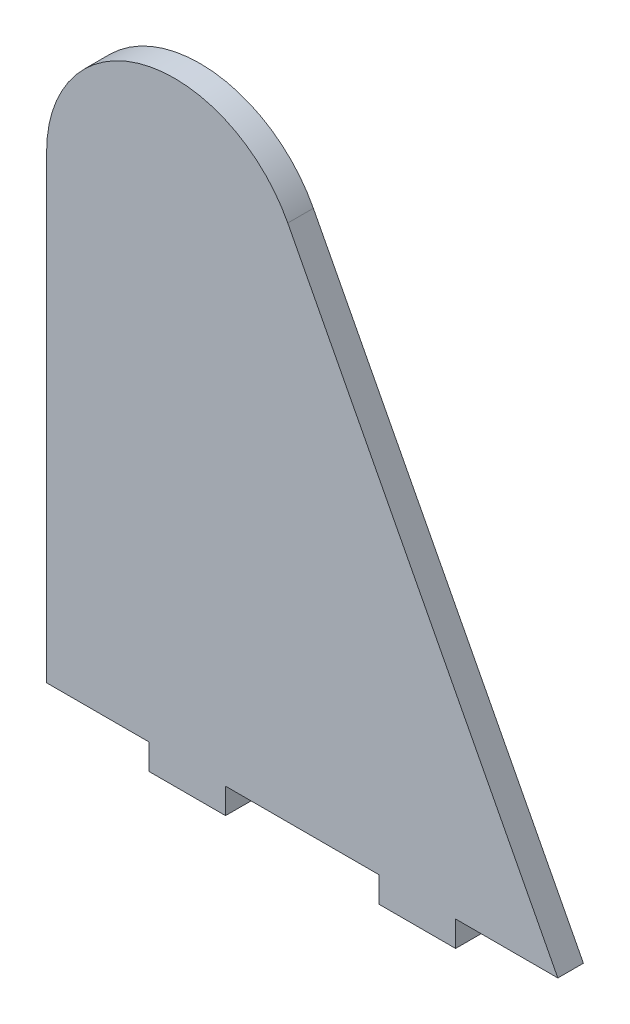
ISO-10303-21;
HEADER;
FILE_DESCRIPTION(('STEP AP214'),'2;1');
FILE_NAME('part.step','',(''),(''),'','','');
FILE_SCHEMA(('AUTOMOTIVE_DESIGN { 1 0 10303 214 1 1 1 1 }'));
ENDSEC;
DATA;
#1=APPLICATION_CONTEXT('core data for automotive mechanical design processes');
#2=APPLICATION_PROTOCOL_DEFINITION('international standard','automotive_design',2000,#1);
#3=PRODUCT_CONTEXT('',#1,'mechanical');
#4=PRODUCT('Part','Part','',(#3));
#5=PRODUCT_RELATED_PRODUCT_CATEGORY('part','',(#4));
#6=PRODUCT_DEFINITION_FORMATION('','',#4);
#7=PRODUCT_DEFINITION_CONTEXT('part definition',#1,'design');
#8=PRODUCT_DEFINITION('design','',#6,#7);
#9=PRODUCT_DEFINITION_SHAPE('','',#8);
#10=(LENGTH_UNIT() NAMED_UNIT(*) SI_UNIT(.MILLI.,.METRE.));
#11=(NAMED_UNIT(*) PLANE_ANGLE_UNIT() SI_UNIT($,.RADIAN.));
#12=(NAMED_UNIT(*) SI_UNIT($,.STERADIAN.) SOLID_ANGLE_UNIT());
#13=UNCERTAINTY_MEASURE_WITH_UNIT(LENGTH_MEASURE(1.E-05),#10,'distance_accuracy_value','');
#14=(GEOMETRIC_REPRESENTATION_CONTEXT(3) GLOBAL_UNCERTAINTY_ASSIGNED_CONTEXT((#13)) GLOBAL_UNIT_ASSIGNED_CONTEXT((#10,
#11,#12)) REPRESENTATION_CONTEXT('',''));
#15=CARTESIAN_POINT('',(0.,0.,0.));
#16=DIRECTION('',(0.,0.,1.));
#17=DIRECTION('',(1.,0.,0.));
#18=AXIS2_PLACEMENT_3D('',#15,#16,#17);
#19=CARTESIAN_POINT('',(0.,0.,5.));
#20=DIRECTION('',(0.,1.,0.));
#21=DIRECTION('',(0.,0.,1.));
#22=AXIS2_PLACEMENT_3D('',#19,#20,#21);
#23=PLANE('',#22);
#24=DIRECTION('',(1.,0.,0.));
#25=VECTOR('',#24,1.);
#26=CARTESIAN_POINT('',(0.,0.,0.));
#27=LINE('',#26,#25);
#28=CARTESIAN_POINT('',(0.,0.,0.));
#29=VERTEX_POINT('',#28);
#30=CARTESIAN_POINT('',(20.,0.,0.));
#31=VERTEX_POINT('',#30);
#32=EDGE_CURVE('E153',#29,#31,#27,.T.);
#33=ORIENTED_EDGE('',*,*,#32,.T.);
#34=DIRECTION('',(0.,0.,-1.));
#35=VECTOR('',#34,1.);
#36=CARTESIAN_POINT('',(20.,0.,5.));
#37=LINE('',#36,#35);
#38=CARTESIAN_POINT('',(20.,0.,5.));
#39=VERTEX_POINT('',#38);
#40=EDGE_CURVE('E11',#39,#31,#37,.T.);
#41=ORIENTED_EDGE('',*,*,#40,.F.);
#42=DIRECTION('',(1.,0.,0.));
#43=VECTOR('',#42,1.);
#44=CARTESIAN_POINT('',(0.,0.,5.));
#45=LINE('',#44,#43);
#46=CARTESIAN_POINT('',(0.,0.,5.));
#47=VERTEX_POINT('',#46);
#48=EDGE_CURVE('E175',#47,#39,#45,.T.);
#49=ORIENTED_EDGE('',*,*,#48,.F.);
#50=DIRECTION('',(0.,0.,-1.));
#51=VECTOR('',#50,1.);
#52=CARTESIAN_POINT('',(0.,0.,5.));
#53=LINE('',#52,#51);
#54=EDGE_CURVE('E149',#47,#29,#53,.T.);
#55=ORIENTED_EDGE('',*,*,#54,.T.);
#56=EDGE_LOOP('',(#33,#41,#49,#55));
#57=FACE_BOUND('',#56,.T.);
#58=ADVANCED_FACE('F33',(#57),#23,.F.);
#59=CARTESIAN_POINT('',(20.,0.,5.));
#60=DIRECTION('',(1.,0.,0.));
#61=DIRECTION('',(0.,0.,-1.));
#62=AXIS2_PLACEMENT_3D('',#59,#60,#61);
#63=PLANE('',#62);
#64=DIRECTION('',(0.,-1.,0.));
#65=VECTOR('',#64,1.);
#66=CARTESIAN_POINT('',(20.,0.,0.));
#67=LINE('',#66,#65);
#68=CARTESIAN_POINT('',(20.,-5.,0.));
#69=VERTEX_POINT('',#68);
#70=EDGE_CURVE('E156',#31,#69,#67,.T.);
#71=ORIENTED_EDGE('',*,*,#70,.T.);
#72=DIRECTION('',(0.,0.,-1.));
#73=VECTOR('',#72,1.);
#74=CARTESIAN_POINT('',(20.,-5.,5.));
#75=LINE('',#74,#73);
#76=CARTESIAN_POINT('',(20.,-5.,5.));
#77=VERTEX_POINT('',#76);
#78=EDGE_CURVE('E41',#77,#69,#75,.T.);
#79=ORIENTED_EDGE('',*,*,#78,.F.);
#80=DIRECTION('',(0.,-1.,0.));
#81=VECTOR('',#80,1.);
#82=CARTESIAN_POINT('',(20.,0.,5.));
#83=LINE('',#82,#81);
#84=EDGE_CURVE('E104',#39,#77,#83,.T.);
#85=ORIENTED_EDGE('',*,*,#84,.F.);
#86=ORIENTED_EDGE('',*,*,#40,.T.);
#87=EDGE_LOOP('',(#71,#79,#85,#86));
#88=FACE_BOUND('',#87,.T.);
#89=ADVANCED_FACE('F253',(#88),#63,.F.);
#90=CARTESIAN_POINT('',(20.,-5.,5.));
#91=DIRECTION('',(0.,1.,0.));
#92=DIRECTION('',(0.,0.,1.));
#93=AXIS2_PLACEMENT_3D('',#90,#91,#92);
#94=PLANE('',#93);
#95=DIRECTION('',(1.,0.,0.));
#96=VECTOR('',#95,1.);
#97=CARTESIAN_POINT('',(20.,-5.,0.));
#98=LINE('',#97,#96);
#99=CARTESIAN_POINT('',(35.,-5.,0.));
#100=VERTEX_POINT('',#99);
#101=EDGE_CURVE('E158',#69,#100,#98,.T.);
#102=ORIENTED_EDGE('',*,*,#101,.T.);
#103=DIRECTION('',(0.,0.,-1.));
#104=VECTOR('',#103,1.);
#105=CARTESIAN_POINT('',(35.,-5.,5.));
#106=LINE('',#105,#104);
#107=CARTESIAN_POINT('',(35.,-5.,5.));
#108=VERTEX_POINT('',#107);
#109=EDGE_CURVE('E194',#108,#100,#106,.T.);
#110=ORIENTED_EDGE('',*,*,#109,.F.);
#111=DIRECTION('',(1.,0.,0.));
#112=VECTOR('',#111,1.);
#113=CARTESIAN_POINT('',(20.,-5.,5.));
#114=LINE('',#113,#112);
#115=EDGE_CURVE('E202',#77,#108,#114,.T.);
#116=ORIENTED_EDGE('',*,*,#115,.F.);
#117=ORIENTED_EDGE('',*,*,#78,.T.);
#118=EDGE_LOOP('',(#102,#110,#116,#117));
#119=FACE_BOUND('',#118,.T.);
#120=ADVANCED_FACE('F200',(#119),#94,.F.);
#121=CARTESIAN_POINT('',(35.,0.,5.));
#122=DIRECTION('',(-1.,0.,0.));
#123=DIRECTION('',(0.,0.,1.));
#124=AXIS2_PLACEMENT_3D('',#121,#122,#123);
#125=PLANE('',#124);
#126=DIRECTION('',(0.,1.,0.));
#127=VECTOR('',#126,1.);
#128=CARTESIAN_POINT('',(35.,0.,0.));
#129=LINE('',#128,#127);
#130=CARTESIAN_POINT('',(35.,0.,0.));
#131=VERTEX_POINT('',#130);
#132=EDGE_CURVE('E160',#100,#131,#129,.T.);
#133=ORIENTED_EDGE('',*,*,#132,.T.);
#134=DIRECTION('',(0.,0.,-1.));
#135=VECTOR('',#134,1.);
#136=CARTESIAN_POINT('',(35.,0.,5.));
#137=LINE('',#136,#135);
#138=CARTESIAN_POINT('',(35.,0.,5.));
#139=VERTEX_POINT('',#138);
#140=EDGE_CURVE('E191',#139,#131,#137,.T.);
#141=ORIENTED_EDGE('',*,*,#140,.F.);
#142=DIRECTION('',(0.,1.,0.));
#143=VECTOR('',#142,1.);
#144=CARTESIAN_POINT('',(35.,0.,5.));
#145=LINE('',#144,#143);
#146=EDGE_CURVE('E220',#108,#139,#145,.T.);
#147=ORIENTED_EDGE('',*,*,#146,.F.);
#148=ORIENTED_EDGE('',*,*,#109,.T.);
#149=EDGE_LOOP('',(#133,#141,#147,#148));
#150=FACE_BOUND('',#149,.T.);
#151=ADVANCED_FACE('F211',(#150),#125,.F.);
#152=CARTESIAN_POINT('',(35.,0.,5.));
#153=DIRECTION('',(0.,1.,0.));
#154=DIRECTION('',(0.,0.,1.));
#155=AXIS2_PLACEMENT_3D('',#152,#153,#154);
#156=PLANE('',#155);
#157=DIRECTION('',(1.,0.,0.));
#158=VECTOR('',#157,1.);
#159=CARTESIAN_POINT('',(35.,0.,0.));
#160=LINE('',#159,#158);
#161=CARTESIAN_POINT('',(65.,0.,0.));
#162=VERTEX_POINT('',#161);
#163=EDGE_CURVE('E162',#131,#162,#160,.T.);
#164=ORIENTED_EDGE('',*,*,#163,.T.);
#165=DIRECTION('',(0.,0.,-1.));
#166=VECTOR('',#165,1.);
#167=CARTESIAN_POINT('',(65.,0.,5.));
#168=LINE('',#167,#166);
#169=CARTESIAN_POINT('',(65.,0.,5.));
#170=VERTEX_POINT('',#169);
#171=EDGE_CURVE('E188',#170,#162,#168,.T.);
#172=ORIENTED_EDGE('',*,*,#171,.F.);
#173=DIRECTION('',(1.,0.,0.));
#174=VECTOR('',#173,1.);
#175=CARTESIAN_POINT('',(35.,0.,5.));
#176=LINE('',#175,#174);
#177=EDGE_CURVE('E217',#139,#170,#176,.T.);
#178=ORIENTED_EDGE('',*,*,#177,.F.);
#179=ORIENTED_EDGE('',*,*,#140,.T.);
#180=EDGE_LOOP('',(#164,#172,#178,#179));
#181=FACE_BOUND('',#180,.T.);
#182=ADVANCED_FACE('F215',(#181),#156,.F.);
#183=CARTESIAN_POINT('',(65.,0.,5.));
#184=DIRECTION('',(1.,0.,0.));
#185=DIRECTION('',(0.,0.,-1.));
#186=AXIS2_PLACEMENT_3D('',#183,#184,#185);
#187=PLANE('',#186);
#188=DIRECTION('',(0.,-1.,0.));
#189=VECTOR('',#188,1.);
#190=CARTESIAN_POINT('',(65.,0.,0.));
#191=LINE('',#190,#189);
#192=CARTESIAN_POINT('',(65.,-5.,0.));
#193=VERTEX_POINT('',#192);
#194=EDGE_CURVE('E164',#162,#193,#191,.T.);
#195=ORIENTED_EDGE('',*,*,#194,.T.);
#196=DIRECTION('',(0.,0.,-1.));
#197=VECTOR('',#196,1.);
#198=CARTESIAN_POINT('',(65.,-5.,5.));
#199=LINE('',#198,#197);
#200=CARTESIAN_POINT('',(65.,-5.,5.));
#201=VERTEX_POINT('',#200);
#202=EDGE_CURVE('E185',#201,#193,#199,.T.);
#203=ORIENTED_EDGE('',*,*,#202,.F.);
#204=DIRECTION('',(0.,-1.,0.));
#205=VECTOR('',#204,1.);
#206=CARTESIAN_POINT('',(65.,0.,5.));
#207=LINE('',#206,#205);
#208=EDGE_CURVE('E219',#170,#201,#207,.T.);
#209=ORIENTED_EDGE('',*,*,#208,.F.);
#210=ORIENTED_EDGE('',*,*,#171,.T.);
#211=EDGE_LOOP('',(#195,#203,#209,#210));
#212=FACE_BOUND('',#211,.T.);
#213=ADVANCED_FACE('F266',(#212),#187,.F.);
#214=CARTESIAN_POINT('',(65.,-5.,5.));
#215=DIRECTION('',(0.,1.,0.));
#216=DIRECTION('',(0.,0.,1.));
#217=AXIS2_PLACEMENT_3D('',#214,#215,#216);
#218=PLANE('',#217);
#219=DIRECTION('',(1.,0.,0.));
#220=VECTOR('',#219,1.);
#221=CARTESIAN_POINT('',(65.,-5.,0.));
#222=LINE('',#221,#220);
#223=CARTESIAN_POINT('',(80.,-5.,0.));
#224=VERTEX_POINT('',#223);
#225=EDGE_CURVE('E166',#193,#224,#222,.T.);
#226=ORIENTED_EDGE('',*,*,#225,.T.);
#227=DIRECTION('',(0.,0.,-1.));
#228=VECTOR('',#227,1.);
#229=CARTESIAN_POINT('',(80.,-5.,5.));
#230=LINE('',#229,#228);
#231=CARTESIAN_POINT('',(80.,-5.,5.));
#232=VERTEX_POINT('',#231);
#233=EDGE_CURVE('E182',#232,#224,#230,.T.);
#234=ORIENTED_EDGE('',*,*,#233,.F.);
#235=DIRECTION('',(1.,0.,0.));
#236=VECTOR('',#235,1.);
#237=CARTESIAN_POINT('',(65.,-5.,5.));
#238=LINE('',#237,#236);
#239=EDGE_CURVE('E222',#201,#232,#238,.T.);
#240=ORIENTED_EDGE('',*,*,#239,.F.);
#241=ORIENTED_EDGE('',*,*,#202,.T.);
#242=EDGE_LOOP('',(#226,#234,#240,#241));
#243=FACE_BOUND('',#242,.T.);
#244=ADVANCED_FACE('F269',(#243),#218,.F.);
#245=CARTESIAN_POINT('',(80.,0.,5.));
#246=DIRECTION('',(-1.,0.,0.));
#247=DIRECTION('',(0.,0.,1.));
#248=AXIS2_PLACEMENT_3D('',#245,#246,#247);
#249=PLANE('',#248);
#250=DIRECTION('',(0.,1.,0.));
#251=VECTOR('',#250,1.);
#252=CARTESIAN_POINT('',(80.,0.,0.));
#253=LINE('',#252,#251);
#254=CARTESIAN_POINT('',(80.,0.,0.));
#255=VERTEX_POINT('',#254);
#256=EDGE_CURVE('E168',#224,#255,#253,.T.);
#257=ORIENTED_EDGE('',*,*,#256,.T.);
#258=DIRECTION('',(0.,0.,-1.));
#259=VECTOR('',#258,1.);
#260=CARTESIAN_POINT('',(80.,0.,5.));
#261=LINE('',#260,#259);
#262=CARTESIAN_POINT('',(80.,0.,5.));
#263=VERTEX_POINT('',#262);
#264=EDGE_CURVE('E179',#263,#255,#261,.T.);
#265=ORIENTED_EDGE('',*,*,#264,.F.);
#266=DIRECTION('',(0.,1.,0.));
#267=VECTOR('',#266,1.);
#268=CARTESIAN_POINT('',(80.,0.,5.));
#269=LINE('',#268,#267);
#270=EDGE_CURVE('E228',#232,#263,#269,.T.);
#271=ORIENTED_EDGE('',*,*,#270,.F.);
#272=ORIENTED_EDGE('',*,*,#233,.T.);
#273=EDGE_LOOP('',(#257,#265,#271,#272));
#274=FACE_BOUND('',#273,.T.);
#275=ADVANCED_FACE('F234',(#274),#249,.F.);
#276=CARTESIAN_POINT('',(80.,0.,5.));
#277=DIRECTION('',(0.,1.,0.));
#278=DIRECTION('',(0.,0.,1.));
#279=AXIS2_PLACEMENT_3D('',#276,#277,#278);
#280=PLANE('',#279);
#281=DIRECTION('',(1.,0.,0.));
#282=VECTOR('',#281,1.);
#283=CARTESIAN_POINT('',(80.,0.,0.));
#284=LINE('',#283,#282);
#285=CARTESIAN_POINT('',(100.,0.,0.));
#286=VERTEX_POINT('',#285);
#287=EDGE_CURVE('E170',#255,#286,#284,.T.);
#288=ORIENTED_EDGE('',*,*,#287,.T.);
#289=DIRECTION('',(0.,0.,-1.));
#290=VECTOR('',#289,1.);
#291=CARTESIAN_POINT('',(100.,0.,5.));
#292=LINE('',#291,#290);
#293=CARTESIAN_POINT('',(100.,0.,5.));
#294=VERTEX_POINT('',#293);
#295=EDGE_CURVE('E144',#294,#286,#292,.T.);
#296=ORIENTED_EDGE('',*,*,#295,.F.);
#297=DIRECTION('',(1.,0.,0.));
#298=VECTOR('',#297,1.);
#299=CARTESIAN_POINT('',(80.,0.,5.));
#300=LINE('',#299,#298);
#301=EDGE_CURVE('E135',#263,#294,#300,.T.);
#302=ORIENTED_EDGE('',*,*,#301,.F.);
#303=ORIENTED_EDGE('',*,*,#264,.T.);
#304=EDGE_LOOP('',(#288,#296,#302,#303));
#305=FACE_BOUND('',#304,.T.);
#306=ADVANCED_FACE('F238',(#305),#280,.F.);
#307=CARTESIAN_POINT('',(100.,0.,5.));
#308=DIRECTION('',(-0.887010833178219,-0.461748613235038,0.));
#309=DIRECTION('',(0.461748613235038,-0.887010833178219,0.));
#310=AXIS2_PLACEMENT_3D('',#307,#308,#309);
#311=PLANE('',#310);
#312=DIRECTION('',(-0.461748613235038,0.887010833178219,0.));
#313=VECTOR('',#312,1.);
#314=CARTESIAN_POINT('',(100.,0.,0.));
#315=LINE('',#314,#313);
#316=CARTESIAN_POINT('',(47.1752708294555,101.475360598707,0.));
#317=VERTEX_POINT('',#316);
#318=EDGE_CURVE('E143',#286,#317,#315,.T.);
#319=ORIENTED_EDGE('',*,*,#318,.T.);
#320=DIRECTION('',(0.,0.,-1.));
#321=VECTOR('',#320,1.);
#322=CARTESIAN_POINT('',(47.1752708294555,101.475360598707,5.));
#323=LINE('',#322,#321);
#324=CARTESIAN_POINT('',(47.1752708294555,101.475360598707,5.));
#325=VERTEX_POINT('',#324);
#326=EDGE_CURVE('E140',#325,#317,#323,.T.);
#327=ORIENTED_EDGE('',*,*,#326,.F.);
#328=DIRECTION('',(-0.461748613235038,0.887010833178219,0.));
#329=VECTOR('',#328,1.);
#330=CARTESIAN_POINT('',(100.,0.,5.));
#331=LINE('',#330,#329);
#332=EDGE_CURVE('E129',#294,#325,#331,.T.);
#333=ORIENTED_EDGE('',*,*,#332,.F.);
#334=ORIENTED_EDGE('',*,*,#295,.T.);
#335=EDGE_LOOP('',(#319,#327,#333,#334));
#336=FACE_BOUND('',#335,.T.);
#337=ADVANCED_FACE('F141',(#336),#311,.F.);
#338=CARTESIAN_POINT('',(25.,89.9316452678312,5.));
#339=DIRECTION('',(0.,0.,-1.));
#340=DIRECTION('',(-1.,0.,0.));
#341=AXIS2_PLACEMENT_3D('',#338,#339,#340);
#342=CYLINDRICAL_SURFACE('',#341,25.);
#343=CARTESIAN_POINT('',(25.,89.9316452678312,0.));
#344=DIRECTION('',(0.,0.,1.));
#345=DIRECTION('',(-1.,0.,0.));
#346=AXIS2_PLACEMENT_3D('',#343,#344,#345);
#347=CIRCLE('',#346,25.);
#348=CARTESIAN_POINT('',(0.,89.9316452678312,0.));
#349=VERTEX_POINT('',#348);
#350=EDGE_CURVE('E90',#317,#349,#347,.T.);
#351=ORIENTED_EDGE('',*,*,#350,.T.);
#352=DIRECTION('',(0.,0.,-1.));
#353=VECTOR('',#352,1.);
#354=CARTESIAN_POINT('',(0.,89.9316452678312,5.));
#355=LINE('',#354,#353);
#356=CARTESIAN_POINT('',(0.,89.9316452678312,5.));
#357=VERTEX_POINT('',#356);
#358=EDGE_CURVE('E145',#357,#349,#355,.T.);
#359=ORIENTED_EDGE('',*,*,#358,.F.);
#360=CARTESIAN_POINT('',(25.,89.9316452678312,5.));
#361=DIRECTION('',(0.,0.,1.));
#362=DIRECTION('',(-1.,0.,0.));
#363=AXIS2_PLACEMENT_3D('',#360,#361,#362);
#364=CIRCLE('',#363,25.);
#365=EDGE_CURVE('E133',#325,#357,#364,.T.);
#366=ORIENTED_EDGE('',*,*,#365,.F.);
#367=ORIENTED_EDGE('',*,*,#326,.T.);
#368=EDGE_LOOP('',(#351,#359,#366,#367));
#369=FACE_BOUND('',#368,.T.);
#370=ADVANCED_FACE('F147',(#369),#342,.T.);
#371=CARTESIAN_POINT('',(0.,89.9316452678312,5.));
#372=DIRECTION('',(1.,0.,0.));
#373=DIRECTION('',(0.,1.,0.));
#374=AXIS2_PLACEMENT_3D('',#371,#372,#373);
#375=PLANE('',#374);
#376=DIRECTION('',(0.,-1.,0.));
#377=VECTOR('',#376,1.);
#378=CARTESIAN_POINT('',(0.,89.9316452678312,0.));
#379=LINE('',#378,#377);
#380=EDGE_CURVE('E96',#349,#29,#379,.T.);
#381=ORIENTED_EDGE('',*,*,#380,.T.);
#382=ORIENTED_EDGE('',*,*,#54,.F.);
#383=DIRECTION('',(0.,-1.,0.));
#384=VECTOR('',#383,1.);
#385=CARTESIAN_POINT('',(0.,89.9316452678312,5.));
#386=LINE('',#385,#384);
#387=EDGE_CURVE('E49',#357,#47,#386,.T.);
#388=ORIENTED_EDGE('',*,*,#387,.F.);
#389=ORIENTED_EDGE('',*,*,#358,.T.);
#390=EDGE_LOOP('',(#381,#382,#388,#389));
#391=FACE_BOUND('',#390,.T.);
#392=ADVANCED_FACE('F242',(#391),#375,.F.);
#393=CARTESIAN_POINT('',(25.,89.9316452678312,5.));
#394=DIRECTION('',(0.,0.,-1.));
#395=DIRECTION('',(-1.,0.,0.));
#396=AXIS2_PLACEMENT_3D('',#393,#394,#395);
#397=PLANE('',#396);
#398=ORIENTED_EDGE('',*,*,#48,.T.);
#399=ORIENTED_EDGE('',*,*,#84,.T.);
#400=ORIENTED_EDGE('',*,*,#115,.T.);
#401=ORIENTED_EDGE('',*,*,#146,.T.);
#402=ORIENTED_EDGE('',*,*,#177,.T.);
#403=ORIENTED_EDGE('',*,*,#208,.T.);
#404=ORIENTED_EDGE('',*,*,#239,.T.);
#405=ORIENTED_EDGE('',*,*,#270,.T.);
#406=ORIENTED_EDGE('',*,*,#301,.T.);
#407=ORIENTED_EDGE('',*,*,#332,.T.);
#408=ORIENTED_EDGE('',*,*,#365,.T.);
#409=ORIENTED_EDGE('',*,*,#387,.T.);
#410=EDGE_LOOP('',(#398,#399,#400,#401,#402,#403,#404,#405,#406,#407,#408,#409));
#411=FACE_BOUND('',#410,.T.);
#412=ADVANCED_FACE('F131',(#411),#397,.F.);
#413=CARTESIAN_POINT('',(25.,89.9316452678312,0.));
#414=DIRECTION('',(0.,0.,-1.));
#415=DIRECTION('',(-1.,0.,0.));
#416=AXIS2_PLACEMENT_3D('',#413,#414,#415);
#417=PLANE('',#416);
#418=ORIENTED_EDGE('',*,*,#32,.F.);
#419=ORIENTED_EDGE('',*,*,#380,.F.);
#420=ORIENTED_EDGE('',*,*,#350,.F.);
#421=ORIENTED_EDGE('',*,*,#318,.F.);
#422=ORIENTED_EDGE('',*,*,#287,.F.);
#423=ORIENTED_EDGE('',*,*,#256,.F.);
#424=ORIENTED_EDGE('',*,*,#225,.F.);
#425=ORIENTED_EDGE('',*,*,#194,.F.);
#426=ORIENTED_EDGE('',*,*,#163,.F.);
#427=ORIENTED_EDGE('',*,*,#132,.F.);
#428=ORIENTED_EDGE('',*,*,#101,.F.);
#429=ORIENTED_EDGE('',*,*,#70,.F.);
#430=EDGE_LOOP('',(#418,#419,#420,#421,#422,#423,#424,#425,#426,#427,#428,#429));
#431=FACE_BOUND('',#430,.T.);
#432=ADVANCED_FACE('F206',(#431),#417,.T.);
#433=CLOSED_SHELL('',(#58,#89,#120,#151,#182,#213,#244,#275,#306,#337,#370,#392,#412,#432));
#434=MANIFOLD_SOLID_BREP('B2',#433);
#435=ADVANCED_BREP_SHAPE_REPRESENTATION('',(#18,#434),#14);
#436=SHAPE_DEFINITION_REPRESENTATION(#9,#435);
ENDSEC;
END-ISO-10303-21;
